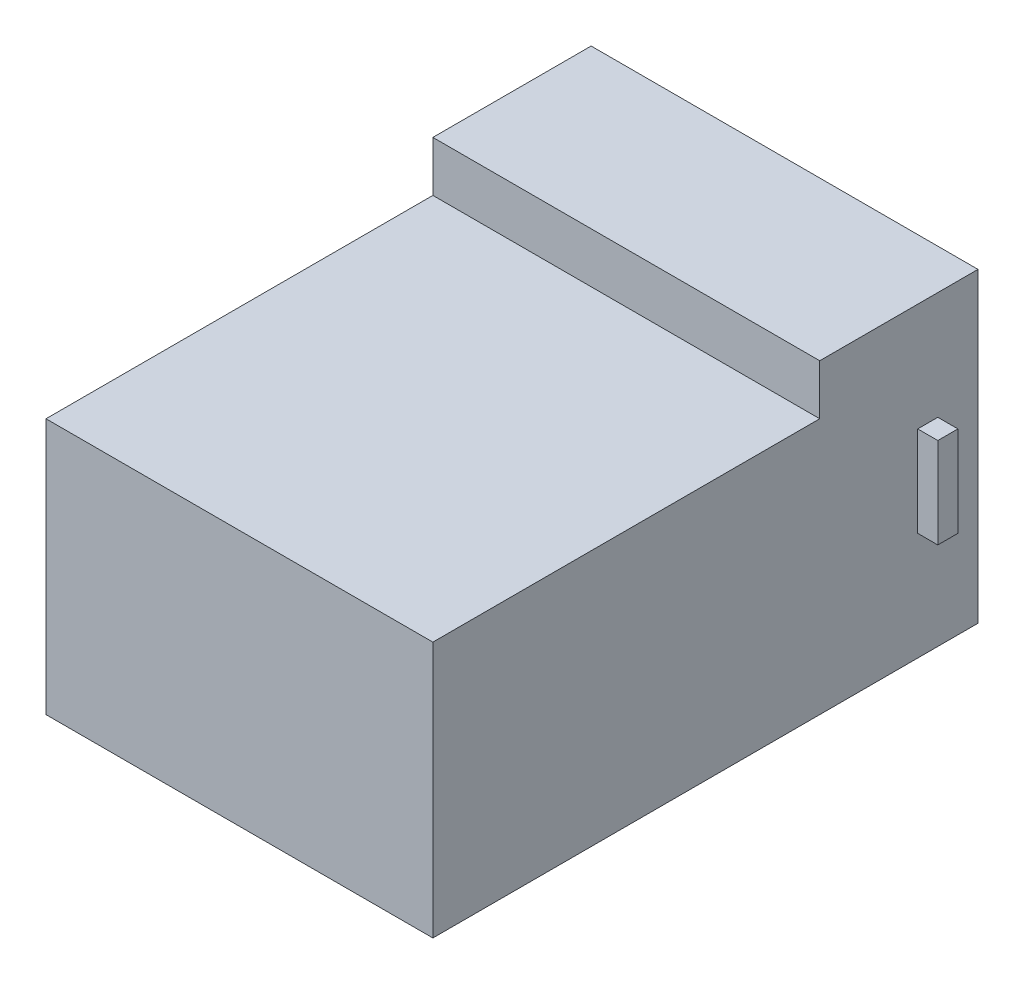
ISO-10303-21;
HEADER;
FILE_DESCRIPTION(('STEP AP214'),'2;1');
FILE_NAME('part.step','',(''),(''),'','','');
FILE_SCHEMA(('AUTOMOTIVE_DESIGN { 1 0 10303 214 1 1 1 1 }'));
ENDSEC;
DATA;
#1=APPLICATION_CONTEXT('core data for automotive mechanical design processes');
#2=APPLICATION_PROTOCOL_DEFINITION('international standard','automotive_design',2000,#1);
#3=PRODUCT_CONTEXT('',#1,'mechanical');
#4=PRODUCT('Part','Part','',(#3));
#5=PRODUCT_RELATED_PRODUCT_CATEGORY('part','',(#4));
#6=PRODUCT_DEFINITION_FORMATION('','',#4);
#7=PRODUCT_DEFINITION_CONTEXT('part definition',#1,'design');
#8=PRODUCT_DEFINITION('design','',#6,#7);
#9=PRODUCT_DEFINITION_SHAPE('','',#8);
#10=(LENGTH_UNIT() NAMED_UNIT(*) SI_UNIT(.MILLI.,.METRE.));
#11=(NAMED_UNIT(*) PLANE_ANGLE_UNIT() SI_UNIT($,.RADIAN.));
#12=(NAMED_UNIT(*) SI_UNIT($,.STERADIAN.) SOLID_ANGLE_UNIT());
#13=UNCERTAINTY_MEASURE_WITH_UNIT(LENGTH_MEASURE(1.E-05),#10,'distance_accuracy_value','');
#14=(GEOMETRIC_REPRESENTATION_CONTEXT(3) GLOBAL_UNCERTAINTY_ASSIGNED_CONTEXT((#13)) GLOBAL_UNIT_ASSIGNED_CONTEXT((#10,
#11,#12)) REPRESENTATION_CONTEXT('',''));
#15=CARTESIAN_POINT('',(0.,0.,0.));
#16=DIRECTION('',(0.,0.,1.));
#17=DIRECTION('',(1.,0.,0.));
#18=AXIS2_PLACEMENT_3D('',#15,#16,#17);
#19=CARTESIAN_POINT('',(0.,0.,108.5));
#20=DIRECTION('',(1.,0.,0.));
#21=DIRECTION('',(0.,0.,-1.));
#22=AXIS2_PLACEMENT_3D('',#19,#20,#21);
#23=PLANE('',#22);
#24=DIRECTION('',(0.,0.,1.));
#25=VECTOR('',#24,1.);
#26=CARTESIAN_POINT('',(0.,51.,108.5));
#27=LINE('',#26,#25);
#28=CARTESIAN_POINT('',(0.,51.,31.5));
#29=VERTEX_POINT('',#28);
#30=CARTESIAN_POINT('',(0.,51.,108.5));
#31=VERTEX_POINT('',#30);
#32=EDGE_CURVE('E194',#29,#31,#27,.T.);
#33=ORIENTED_EDGE('',*,*,#32,.F.);
#34=DIRECTION('',(0.,1.,0.));
#35=VECTOR('',#34,1.);
#36=CARTESIAN_POINT('',(0.,51.,31.5));
#37=LINE('',#36,#35);
#38=CARTESIAN_POINT('',(0.,61.,31.5));
#39=VERTEX_POINT('',#38);
#40=EDGE_CURVE('E205',#29,#39,#37,.T.);
#41=ORIENTED_EDGE('',*,*,#40,.T.);
#42=DIRECTION('',(0.,0.,-1.));
#43=VECTOR('',#42,1.);
#44=CARTESIAN_POINT('',(0.,61.,108.5));
#45=LINE('',#44,#43);
#46=CARTESIAN_POINT('',(0.,61.,0.));
#47=VERTEX_POINT('',#46);
#48=EDGE_CURVE('E218',#39,#47,#45,.T.);
#49=ORIENTED_EDGE('',*,*,#48,.T.);
#50=DIRECTION('',(0.,-1.,0.));
#51=VECTOR('',#50,1.);
#52=CARTESIAN_POINT('',(0.,0.,0.));
#53=LINE('',#52,#51);
#54=CARTESIAN_POINT('',(0.,0.,0.));
#55=VERTEX_POINT('',#54);
#56=EDGE_CURVE('E208',#47,#55,#53,.T.);
#57=ORIENTED_EDGE('',*,*,#56,.T.);
#58=DIRECTION('',(0.,0.,-1.));
#59=VECTOR('',#58,1.);
#60=CARTESIAN_POINT('',(0.,0.,108.5));
#61=LINE('',#60,#59);
#62=CARTESIAN_POINT('',(0.,0.,108.5));
#63=VERTEX_POINT('',#62);
#64=EDGE_CURVE('E234',#63,#55,#61,.T.);
#65=ORIENTED_EDGE('',*,*,#64,.F.);
#66=DIRECTION('',(0.,-1.,0.));
#67=VECTOR('',#66,1.);
#68=CARTESIAN_POINT('',(0.,0.,108.5));
#69=LINE('',#68,#67);
#70=EDGE_CURVE('E210',#31,#63,#69,.T.);
#71=ORIENTED_EDGE('',*,*,#70,.F.);
#72=EDGE_LOOP('',(#33,#41,#49,#57,#65,#71));
#73=FACE_BOUND('',#72,.T.);
#74=DIRECTION('',(0.,0.,1.));
#75=VECTOR('',#74,1.);
#76=CARTESIAN_POINT('',(0.,21.5,108.5));
#77=LINE('',#76,#75);
#78=CARTESIAN_POINT('',(0.,21.5,7.99999999999999));
#79=VERTEX_POINT('',#78);
#80=CARTESIAN_POINT('',(0.,21.5,12.));
#81=VERTEX_POINT('',#80);
#82=EDGE_CURVE('E63',#79,#81,#77,.T.);
#83=ORIENTED_EDGE('',*,*,#82,.F.);
#84=DIRECTION('',(0.,1.,0.));
#85=VECTOR('',#84,1.);
#86=CARTESIAN_POINT('',(0.,0.,7.99999999999999));
#87=LINE('',#86,#85);
#88=CARTESIAN_POINT('',(0.,39.5,8.));
#89=VERTEX_POINT('',#88);
#90=EDGE_CURVE('E159',#79,#89,#87,.T.);
#91=ORIENTED_EDGE('',*,*,#90,.T.);
#92=DIRECTION('',(0.,0.,-1.));
#93=VECTOR('',#92,1.);
#94=CARTESIAN_POINT('',(0.,39.5,108.5));
#95=LINE('',#94,#93);
#96=CARTESIAN_POINT('',(0.,39.5,12.));
#97=VERTEX_POINT('',#96);
#98=EDGE_CURVE('E186',#97,#89,#95,.T.);
#99=ORIENTED_EDGE('',*,*,#98,.F.);
#100=DIRECTION('',(0.,-1.,0.));
#101=VECTOR('',#100,1.);
#102=CARTESIAN_POINT('',(0.,0.,12.));
#103=LINE('',#102,#101);
#104=EDGE_CURVE('E59',#97,#81,#103,.T.);
#105=ORIENTED_EDGE('',*,*,#104,.T.);
#106=EDGE_LOOP('',(#83,#91,#99,#105));
#107=FACE_BOUND('',#106,.T.);
#108=ADVANCED_FACE('F45',(#73,#107),#23,.F.);
#109=CARTESIAN_POINT('',(77.,0.,108.5));
#110=DIRECTION('',(-1.,0.,0.));
#111=DIRECTION('',(0.,0.,1.));
#112=AXIS2_PLACEMENT_3D('',#109,#110,#111);
#113=PLANE('',#112);
#114=DIRECTION('',(0.,0.,-1.));
#115=VECTOR('',#114,1.);
#116=CARTESIAN_POINT('',(77.,61.,108.5));
#117=LINE('',#116,#115);
#118=CARTESIAN_POINT('',(77.,61.,31.5));
#119=VERTEX_POINT('',#118);
#120=CARTESIAN_POINT('',(77.,61.,0.));
#121=VERTEX_POINT('',#120);
#122=EDGE_CURVE('E229',#119,#121,#117,.T.);
#123=ORIENTED_EDGE('',*,*,#122,.F.);
#124=DIRECTION('',(0.,1.,0.));
#125=VECTOR('',#124,1.);
#126=CARTESIAN_POINT('',(77.,51.,31.5));
#127=LINE('',#126,#125);
#128=CARTESIAN_POINT('',(77.,51.,31.5));
#129=VERTEX_POINT('',#128);
#130=EDGE_CURVE('E203',#129,#119,#127,.T.);
#131=ORIENTED_EDGE('',*,*,#130,.F.);
#132=DIRECTION('',(0.,0.,-1.));
#133=VECTOR('',#132,1.);
#134=CARTESIAN_POINT('',(77.,51.,108.5));
#135=LINE('',#134,#133);
#136=CARTESIAN_POINT('',(77.,51.,108.5));
#137=VERTEX_POINT('',#136);
#138=EDGE_CURVE('E198',#137,#129,#135,.T.);
#139=ORIENTED_EDGE('',*,*,#138,.F.);
#140=DIRECTION('',(0.,1.,0.));
#141=VECTOR('',#140,1.);
#142=CARTESIAN_POINT('',(77.,0.,108.5));
#143=LINE('',#142,#141);
#144=CARTESIAN_POINT('',(77.,0.,108.5));
#145=VERTEX_POINT('',#144);
#146=EDGE_CURVE('E215',#145,#137,#143,.T.);
#147=ORIENTED_EDGE('',*,*,#146,.F.);
#148=DIRECTION('',(0.,0.,-1.));
#149=VECTOR('',#148,1.);
#150=CARTESIAN_POINT('',(77.,0.,108.5));
#151=LINE('',#150,#149);
#152=CARTESIAN_POINT('',(77.,0.,0.));
#153=VERTEX_POINT('',#152);
#154=EDGE_CURVE('E231',#145,#153,#151,.T.);
#155=ORIENTED_EDGE('',*,*,#154,.T.);
#156=DIRECTION('',(0.,1.,0.));
#157=VECTOR('',#156,1.);
#158=CARTESIAN_POINT('',(77.,0.,0.));
#159=LINE('',#158,#157);
#160=EDGE_CURVE('E223',#153,#121,#159,.T.);
#161=ORIENTED_EDGE('',*,*,#160,.T.);
#162=EDGE_LOOP('',(#123,#131,#139,#147,#155,#161));
#163=FACE_BOUND('',#162,.T.);
#164=DIRECTION('',(0.,0.,-1.));
#165=VECTOR('',#164,1.);
#166=CARTESIAN_POINT('',(77.,21.5,108.5));
#167=LINE('',#166,#165);
#168=CARTESIAN_POINT('',(77.,21.5,12.));
#169=VERTEX_POINT('',#168);
#170=CARTESIAN_POINT('',(77.,21.5,8.00000000000001));
#171=VERTEX_POINT('',#170);
#172=EDGE_CURVE('E12',#169,#171,#167,.T.);
#173=ORIENTED_EDGE('',*,*,#172,.F.);
#174=DIRECTION('',(0.,1.,0.));
#175=VECTOR('',#174,1.);
#176=CARTESIAN_POINT('',(77.,0.,12.));
#177=LINE('',#176,#175);
#178=CARTESIAN_POINT('',(77.,39.5,12.));
#179=VERTEX_POINT('',#178);
#180=EDGE_CURVE('E52',#169,#179,#177,.T.);
#181=ORIENTED_EDGE('',*,*,#180,.T.);
#182=DIRECTION('',(0.,0.,1.));
#183=VECTOR('',#182,1.);
#184=CARTESIAN_POINT('',(77.,39.5,108.5));
#185=LINE('',#184,#183);
#186=CARTESIAN_POINT('',(77.,39.5,8.00000000000001));
#187=VERTEX_POINT('',#186);
#188=EDGE_CURVE('E237',#187,#179,#185,.T.);
#189=ORIENTED_EDGE('',*,*,#188,.F.);
#190=DIRECTION('',(0.,-1.,0.));
#191=VECTOR('',#190,1.);
#192=CARTESIAN_POINT('',(77.,0.,8.00000000000001));
#193=LINE('',#192,#191);
#194=EDGE_CURVE('E240',#187,#171,#193,.T.);
#195=ORIENTED_EDGE('',*,*,#194,.T.);
#196=EDGE_LOOP('',(#173,#181,#189,#195));
#197=FACE_BOUND('',#196,.T.);
#198=ADVANCED_FACE('F243',(#163,#197),#113,.F.);
#199=CARTESIAN_POINT('',(0.,0.,108.5));
#200=DIRECTION('',(0.,1.,0.));
#201=DIRECTION('',(0.,0.,1.));
#202=AXIS2_PLACEMENT_3D('',#199,#200,#201);
#203=PLANE('',#202);
#204=DIRECTION('',(1.,0.,0.));
#205=VECTOR('',#204,1.);
#206=CARTESIAN_POINT('',(0.,0.,0.));
#207=LINE('',#206,#205);
#208=EDGE_CURVE('E221',#55,#153,#207,.T.);
#209=ORIENTED_EDGE('',*,*,#208,.T.);
#210=ORIENTED_EDGE('',*,*,#154,.F.);
#211=DIRECTION('',(1.,0.,0.));
#212=VECTOR('',#211,1.);
#213=CARTESIAN_POINT('',(0.,0.,108.5));
#214=LINE('',#213,#212);
#215=EDGE_CURVE('E212',#63,#145,#214,.T.);
#216=ORIENTED_EDGE('',*,*,#215,.F.);
#217=ORIENTED_EDGE('',*,*,#64,.T.);
#218=EDGE_LOOP('',(#209,#210,#216,#217));
#219=FACE_BOUND('',#218,.T.);
#220=ADVANCED_FACE('F285',(#219),#203,.F.);
#221=CARTESIAN_POINT('',(0.,61.,108.5));
#222=DIRECTION('',(0.,-1.,0.));
#223=DIRECTION('',(0.,0.,-1.));
#224=AXIS2_PLACEMENT_3D('',#221,#222,#223);
#225=PLANE('',#224);
#226=ORIENTED_EDGE('',*,*,#48,.F.);
#227=DIRECTION('',(-1.,0.,0.));
#228=VECTOR('',#227,1.);
#229=CARTESIAN_POINT('',(0.,61.,31.5));
#230=LINE('',#229,#228);
#231=EDGE_CURVE('E193',#119,#39,#230,.T.);
#232=ORIENTED_EDGE('',*,*,#231,.F.);
#233=ORIENTED_EDGE('',*,*,#122,.T.);
#234=DIRECTION('',(-1.,0.,0.));
#235=VECTOR('',#234,1.);
#236=CARTESIAN_POINT('',(0.,61.,0.));
#237=LINE('',#236,#235);
#238=EDGE_CURVE('E213',#121,#47,#237,.T.);
#239=ORIENTED_EDGE('',*,*,#238,.T.);
#240=EDGE_LOOP('',(#226,#232,#233,#239));
#241=FACE_BOUND('',#240,.T.);
#242=ADVANCED_FACE('F308',(#241),#225,.F.);
#243=CARTESIAN_POINT('',(0.,0.,108.5));
#244=DIRECTION('',(0.,0.,-1.));
#245=DIRECTION('',(-1.,0.,0.));
#246=AXIS2_PLACEMENT_3D('',#243,#244,#245);
#247=PLANE('',#246);
#248=ORIENTED_EDGE('',*,*,#146,.T.);
#249=DIRECTION('',(1.,0.,0.));
#250=VECTOR('',#249,1.);
#251=CARTESIAN_POINT('',(0.,51.,108.5));
#252=LINE('',#251,#250);
#253=EDGE_CURVE('E196',#31,#137,#252,.T.);
#254=ORIENTED_EDGE('',*,*,#253,.F.);
#255=ORIENTED_EDGE('',*,*,#70,.T.);
#256=ORIENTED_EDGE('',*,*,#215,.T.);
#257=EDGE_LOOP('',(#248,#254,#255,#256));
#258=FACE_BOUND('',#257,.T.);
#259=ADVANCED_FACE('F297',(#258),#247,.F.);
#260=CARTESIAN_POINT('',(0.,0.,0.));
#261=DIRECTION('',(0.,0.,-1.));
#262=DIRECTION('',(-1.,0.,0.));
#263=AXIS2_PLACEMENT_3D('',#260,#261,#262);
#264=PLANE('',#263);
#265=ORIENTED_EDGE('',*,*,#56,.F.);
#266=ORIENTED_EDGE('',*,*,#238,.F.);
#267=ORIENTED_EDGE('',*,*,#160,.F.);
#268=ORIENTED_EDGE('',*,*,#208,.F.);
#269=EDGE_LOOP('',(#265,#266,#267,#268));
#270=FACE_BOUND('',#269,.T.);
#271=ADVANCED_FACE('F312',(#270),#264,.T.);
#272=CARTESIAN_POINT('',(0.,51.,31.5));
#273=DIRECTION('',(0.,0.,-1.));
#274=DIRECTION('',(-1.,0.,0.));
#275=AXIS2_PLACEMENT_3D('',#272,#273,#274);
#276=PLANE('',#275);
#277=ORIENTED_EDGE('',*,*,#231,.T.);
#278=ORIENTED_EDGE('',*,*,#40,.F.);
#279=DIRECTION('',(-1.,0.,0.));
#280=VECTOR('',#279,1.);
#281=CARTESIAN_POINT('',(0.,51.,31.5));
#282=LINE('',#281,#280);
#283=EDGE_CURVE('E200',#129,#29,#282,.T.);
#284=ORIENTED_EDGE('',*,*,#283,.F.);
#285=ORIENTED_EDGE('',*,*,#130,.T.);
#286=EDGE_LOOP('',(#277,#278,#284,#285));
#287=FACE_BOUND('',#286,.T.);
#288=ADVANCED_FACE('F305',(#287),#276,.F.);
#289=CARTESIAN_POINT('',(0.,51.,0.));
#290=DIRECTION('',(0.,-1.,0.));
#291=DIRECTION('',(0.,0.,-1.));
#292=AXIS2_PLACEMENT_3D('',#289,#290,#291);
#293=PLANE('',#292);
#294=ORIENTED_EDGE('',*,*,#32,.T.);
#295=ORIENTED_EDGE('',*,*,#253,.T.);
#296=ORIENTED_EDGE('',*,*,#138,.T.);
#297=ORIENTED_EDGE('',*,*,#283,.T.);
#298=EDGE_LOOP('',(#294,#295,#296,#297));
#299=FACE_BOUND('',#298,.T.);
#300=ADVANCED_FACE('F275',(#299),#293,.F.);
#301=CARTESIAN_POINT('',(81.,146.094065598019,8.00000000000001));
#302=DIRECTION('',(1.,0.,0.));
#303=DIRECTION('',(0.,0.,-1.));
#304=AXIS2_PLACEMENT_3D('',#301,#302,#303);
#305=PLANE('',#304);
#306=DIRECTION('',(0.,0.,-1.));
#307=VECTOR('',#306,1.);
#308=CARTESIAN_POINT('',(81.,39.5,8.00000000000001));
#309=LINE('',#308,#307);
#310=CARTESIAN_POINT('',(81.,39.5,12.));
#311=VERTEX_POINT('',#310);
#312=CARTESIAN_POINT('',(81.,39.5,8.00000000000001));
#313=VERTEX_POINT('',#312);
#314=EDGE_CURVE('E178',#311,#313,#309,.T.);
#315=ORIENTED_EDGE('',*,*,#314,.F.);
#316=DIRECTION('',(0.,-1.,0.));
#317=VECTOR('',#316,1.);
#318=CARTESIAN_POINT('',(81.,146.094065598019,12.));
#319=LINE('',#318,#317);
#320=CARTESIAN_POINT('',(81.,21.5,12.));
#321=VERTEX_POINT('',#320);
#322=EDGE_CURVE('E179',#311,#321,#319,.T.);
#323=ORIENTED_EDGE('',*,*,#322,.T.);
#324=DIRECTION('',(0.,0.,1.));
#325=VECTOR('',#324,1.);
#326=CARTESIAN_POINT('',(81.,21.5,8.00000000000001));
#327=LINE('',#326,#325);
#328=CARTESIAN_POINT('',(81.,21.5,8.00000000000001));
#329=VERTEX_POINT('',#328);
#330=EDGE_CURVE('E161',#329,#321,#327,.T.);
#331=ORIENTED_EDGE('',*,*,#330,.F.);
#332=DIRECTION('',(0.,-1.,0.));
#333=VECTOR('',#332,1.);
#334=CARTESIAN_POINT('',(81.,146.094065598019,8.00000000000001));
#335=LINE('',#334,#333);
#336=EDGE_CURVE('E153',#313,#329,#335,.T.);
#337=ORIENTED_EDGE('',*,*,#336,.F.);
#338=EDGE_LOOP('',(#315,#323,#331,#337));
#339=FACE_BOUND('',#338,.T.);
#340=ADVANCED_FACE('F261',(#339),#305,.T.);
#341=CARTESIAN_POINT('',(0.,21.5,0.));
#342=DIRECTION('',(0.,1.,0.));
#343=DIRECTION('',(0.,0.,1.));
#344=AXIS2_PLACEMENT_3D('',#341,#342,#343);
#345=PLANE('',#344);
#346=DIRECTION('',(-1.,0.,0.));
#347=VECTOR('',#346,1.);
#348=CARTESIAN_POINT('',(-4.,21.5,12.));
#349=LINE('',#348,#347);
#350=EDGE_CURVE('E154',#321,#169,#349,.T.);
#351=ORIENTED_EDGE('',*,*,#350,.T.);
#352=ORIENTED_EDGE('',*,*,#172,.T.);
#353=DIRECTION('',(1.,0.,0.));
#354=VECTOR('',#353,1.);
#355=CARTESIAN_POINT('',(-4.,21.5,8.));
#356=LINE('',#355,#354);
#357=EDGE_CURVE('E162',#171,#329,#356,.T.);
#358=ORIENTED_EDGE('',*,*,#357,.T.);
#359=ORIENTED_EDGE('',*,*,#330,.T.);
#360=EDGE_LOOP('',(#351,#352,#358,#359));
#361=FACE_BOUND('',#360,.T.);
#362=ADVANCED_FACE('F266',(#361),#345,.F.);
#363=CARTESIAN_POINT('',(0.,39.5,108.5));
#364=DIRECTION('',(0.,-1.,0.));
#365=DIRECTION('',(0.,0.,-1.));
#366=AXIS2_PLACEMENT_3D('',#363,#364,#365);
#367=PLANE('',#366);
#368=DIRECTION('',(-1.,0.,0.));
#369=VECTOR('',#368,1.);
#370=CARTESIAN_POINT('',(-4.,39.5,8.));
#371=LINE('',#370,#369);
#372=EDGE_CURVE('E183',#313,#187,#371,.T.);
#373=ORIENTED_EDGE('',*,*,#372,.T.);
#374=ORIENTED_EDGE('',*,*,#188,.T.);
#375=DIRECTION('',(1.,0.,0.));
#376=VECTOR('',#375,1.);
#377=CARTESIAN_POINT('',(-4.,39.5,12.));
#378=LINE('',#377,#376);
#379=EDGE_CURVE('E250',#179,#311,#378,.T.);
#380=ORIENTED_EDGE('',*,*,#379,.T.);
#381=ORIENTED_EDGE('',*,*,#314,.T.);
#382=EDGE_LOOP('',(#373,#374,#380,#381));
#383=FACE_BOUND('',#382,.T.);
#384=ADVANCED_FACE('F249',(#383),#367,.F.);
#385=CARTESIAN_POINT('',(-4.,146.094065598019,8.));
#386=DIRECTION('',(0.,0.,-1.));
#387=DIRECTION('',(-1.,0.,0.));
#388=AXIS2_PLACEMENT_3D('',#385,#386,#387);
#389=PLANE('',#388);
#390=ORIENTED_EDGE('',*,*,#194,.F.);
#391=ORIENTED_EDGE('',*,*,#372,.F.);
#392=ORIENTED_EDGE('',*,*,#336,.T.);
#393=ORIENTED_EDGE('',*,*,#357,.F.);
#394=EDGE_LOOP('',(#390,#391,#392,#393));
#395=FACE_BOUND('',#394,.T.);
#396=ADVANCED_FACE('F264',(#395),#389,.T.);
#397=CARTESIAN_POINT('',(-4.,146.094065598019,12.));
#398=DIRECTION('',(0.,0.,1.));
#399=DIRECTION('',(1.,0.,0.));
#400=AXIS2_PLACEMENT_3D('',#397,#398,#399);
#401=PLANE('',#400);
#402=ORIENTED_EDGE('',*,*,#180,.F.);
#403=ORIENTED_EDGE('',*,*,#350,.F.);
#404=ORIENTED_EDGE('',*,*,#322,.F.);
#405=ORIENTED_EDGE('',*,*,#379,.F.);
#406=EDGE_LOOP('',(#402,#403,#404,#405));
#407=FACE_BOUND('',#406,.T.);
#408=ADVANCED_FACE('F254',(#407),#401,.T.);
#409=ORIENTED_EDGE('',*,*,#104,.F.);
#410=CARTESIAN_POINT('',(-4.,39.5,12.));
#411=VERTEX_POINT('',#410);
#412=EDGE_CURVE('E255',#411,#97,#378,.T.);
#413=ORIENTED_EDGE('',*,*,#412,.F.);
#414=DIRECTION('',(0.,-1.,0.));
#415=VECTOR('',#414,1.);
#416=CARTESIAN_POINT('',(-4.,146.094065598019,12.));
#417=LINE('',#416,#415);
#418=CARTESIAN_POINT('',(-4.,21.5,12.));
#419=VERTEX_POINT('',#418);
#420=EDGE_CURVE('E176',#411,#419,#417,.T.);
#421=ORIENTED_EDGE('',*,*,#420,.T.);
#422=EDGE_CURVE('E166',#81,#419,#349,.T.);
#423=ORIENTED_EDGE('',*,*,#422,.F.);
#424=EDGE_LOOP('',(#409,#413,#421,#423));
#425=FACE_BOUND('',#424,.T.);
#426=ADVANCED_FACE('F330',(#425),#401,.T.);
#427=ORIENTED_EDGE('',*,*,#90,.F.);
#428=CARTESIAN_POINT('',(-4.,21.5,8.));
#429=VERTEX_POINT('',#428);
#430=EDGE_CURVE('E157',#429,#79,#356,.T.);
#431=ORIENTED_EDGE('',*,*,#430,.F.);
#432=DIRECTION('',(0.,-1.,0.));
#433=VECTOR('',#432,1.);
#434=CARTESIAN_POINT('',(-4.,146.094065598019,8.));
#435=LINE('',#434,#433);
#436=CARTESIAN_POINT('',(-4.,39.5,8.));
#437=VERTEX_POINT('',#436);
#438=EDGE_CURVE('E144',#437,#429,#435,.T.);
#439=ORIENTED_EDGE('',*,*,#438,.F.);
#440=EDGE_CURVE('E187',#89,#437,#371,.T.);
#441=ORIENTED_EDGE('',*,*,#440,.F.);
#442=EDGE_LOOP('',(#427,#431,#439,#441));
#443=FACE_BOUND('',#442,.T.);
#444=ADVANCED_FACE('F158',(#443),#389,.T.);
#445=ORIENTED_EDGE('',*,*,#430,.T.);
#446=ORIENTED_EDGE('',*,*,#82,.T.);
#447=ORIENTED_EDGE('',*,*,#422,.T.);
#448=DIRECTION('',(0.,0.,-1.));
#449=VECTOR('',#448,1.);
#450=CARTESIAN_POINT('',(-4.,21.5,8.));
#451=LINE('',#450,#449);
#452=EDGE_CURVE('E149',#419,#429,#451,.T.);
#453=ORIENTED_EDGE('',*,*,#452,.T.);
#454=EDGE_LOOP('',(#445,#446,#447,#453));
#455=FACE_BOUND('',#454,.T.);
#456=ADVANCED_FACE('F164',(#455),#345,.F.);
#457=ORIENTED_EDGE('',*,*,#412,.T.);
#458=ORIENTED_EDGE('',*,*,#98,.T.);
#459=ORIENTED_EDGE('',*,*,#440,.T.);
#460=DIRECTION('',(0.,0.,1.));
#461=VECTOR('',#460,1.);
#462=CARTESIAN_POINT('',(-4.,39.5,8.));
#463=LINE('',#462,#461);
#464=EDGE_CURVE('E150',#437,#411,#463,.T.);
#465=ORIENTED_EDGE('',*,*,#464,.T.);
#466=EDGE_LOOP('',(#457,#458,#459,#465));
#467=FACE_BOUND('',#466,.T.);
#468=ADVANCED_FACE('F274',(#467),#367,.F.);
#469=CARTESIAN_POINT('',(-4.,146.094065598019,8.));
#470=DIRECTION('',(-1.,0.,0.));
#471=DIRECTION('',(0.,0.,1.));
#472=AXIS2_PLACEMENT_3D('',#469,#470,#471);
#473=PLANE('',#472);
#474=ORIENTED_EDGE('',*,*,#464,.F.);
#475=ORIENTED_EDGE('',*,*,#438,.T.);
#476=ORIENTED_EDGE('',*,*,#452,.F.);
#477=ORIENTED_EDGE('',*,*,#420,.F.);
#478=EDGE_LOOP('',(#474,#475,#476,#477));
#479=FACE_BOUND('',#478,.T.);
#480=ADVANCED_FACE('F146',(#479),#473,.T.);
#481=CLOSED_SHELL('',(#108,#198,#220,#242,#259,#271,#288,#300,#340,#362,#384,#396,#408,#426,
#444,#456,#468,#480));
#482=MANIFOLD_SOLID_BREP('B2',#481);
#483=ADVANCED_BREP_SHAPE_REPRESENTATION('',(#18,#482),#14);
#484=SHAPE_DEFINITION_REPRESENTATION(#9,#483);
ENDSEC;
END-ISO-10303-21;
